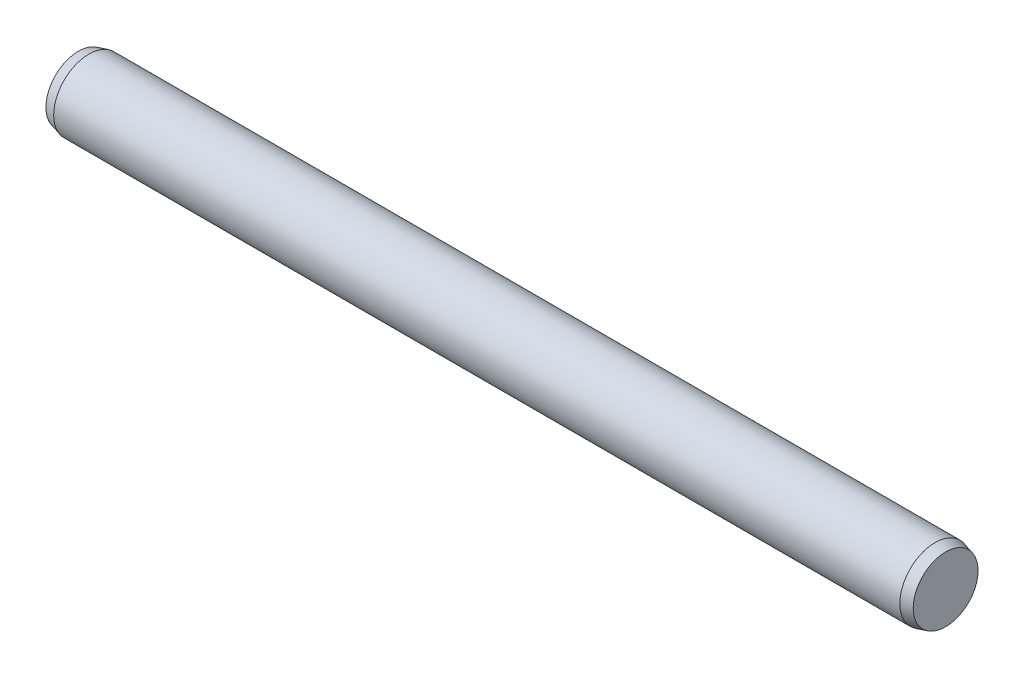
ISO-10303-21;
HEADER;
FILE_DESCRIPTION(('STEP AP214'),'2;1');
FILE_NAME('part.step','',(''),(''),'','','');
FILE_SCHEMA(('AUTOMOTIVE_DESIGN { 1 0 10303 214 1 1 1 1 }'));
ENDSEC;
DATA;
#1=APPLICATION_CONTEXT('core data for automotive mechanical design processes');
#2=APPLICATION_PROTOCOL_DEFINITION('international standard','automotive_design',2000,#1);
#3=PRODUCT_CONTEXT('',#1,'mechanical');
#4=PRODUCT('Part','Part','',(#3));
#5=PRODUCT_RELATED_PRODUCT_CATEGORY('part','',(#4));
#6=PRODUCT_DEFINITION_FORMATION('','',#4);
#7=PRODUCT_DEFINITION_CONTEXT('part definition',#1,'design');
#8=PRODUCT_DEFINITION('design','',#6,#7);
#9=PRODUCT_DEFINITION_SHAPE('','',#8);
#10=(LENGTH_UNIT() NAMED_UNIT(*) SI_UNIT(.MILLI.,.METRE.));
#11=(NAMED_UNIT(*) PLANE_ANGLE_UNIT() SI_UNIT($,.RADIAN.));
#12=(NAMED_UNIT(*) SI_UNIT($,.STERADIAN.) SOLID_ANGLE_UNIT());
#13=UNCERTAINTY_MEASURE_WITH_UNIT(LENGTH_MEASURE(1.E-05),#10,'distance_accuracy_value','');
#14=(GEOMETRIC_REPRESENTATION_CONTEXT(3) GLOBAL_UNCERTAINTY_ASSIGNED_CONTEXT((#13)) GLOBAL_UNIT_ASSIGNED_CONTEXT((#10,
#11,#12)) REPRESENTATION_CONTEXT('',''));
#15=CARTESIAN_POINT('',(0.,0.,0.));
#16=DIRECTION('',(0.,0.,1.));
#17=DIRECTION('',(1.,0.,0.));
#18=AXIS2_PLACEMENT_3D('',#15,#16,#17);
#19=CARTESIAN_POINT('',(-12.,0.,0.));
#20=DIRECTION('',(1.,0.,0.));
#21=DIRECTION('',(0.,0.,1.));
#22=AXIS2_PLACEMENT_3D('',#19,#20,#21);
#23=CYLINDRICAL_SURFACE('',#22,1.);
#24=CARTESIAN_POINT('',(-12.,0.,0.));
#25=DIRECTION('',(1.,0.,0.));
#26=DIRECTION('',(0.,0.,-1.));
#27=AXIS2_PLACEMENT_3D('',#24,#25,#26);
#28=CIRCLE('',#27,1.);
#29=CARTESIAN_POINT('',(-12.,0.,-1.));
#30=VERTEX_POINT('',#29);
#31=EDGE_CURVE('E49',#30,#30,#28,.T.);
#32=ORIENTED_EDGE('',*,*,#31,.T.);
#33=EDGE_LOOP('',(#32));
#34=FACE_BOUND('',#33,.T.);
#35=CARTESIAN_POINT('',(12.,0.,0.));
#36=DIRECTION('',(-1.,0.,0.));
#37=DIRECTION('',(0.,0.,1.));
#38=AXIS2_PLACEMENT_3D('',#35,#36,#37);
#39=CIRCLE('',#38,1.);
#40=CARTESIAN_POINT('',(12.,0.,1.));
#41=VERTEX_POINT('',#40);
#42=EDGE_CURVE('E10',#41,#41,#39,.T.);
#43=ORIENTED_EDGE('',*,*,#42,.T.);
#44=EDGE_LOOP('',(#43));
#45=FACE_BOUND('',#44,.T.);
#46=ADVANCED_FACE('F35',(#34,#45),#23,.T.);
#47=CARTESIAN_POINT('',(12.,0.,0.));
#48=DIRECTION('',(-1.,0.,0.));
#49=DIRECTION('',(0.,0.,1.));
#50=AXIS2_PLACEMENT_3D('',#47,#48,#49);
#51=CONICAL_SURFACE('',#50,1.,0.26179938779915);
#52=CARTESIAN_POINT('',(12.3,0.,0.));
#53=DIRECTION('',(-1.,0.,0.));
#54=DIRECTION('',(0.,0.,1.));
#55=AXIS2_PLACEMENT_3D('',#52,#53,#54);
#56=CIRCLE('',#55,0.919615242270664);
#57=CARTESIAN_POINT('',(12.3,0.,0.919615242270664));
#58=VERTEX_POINT('',#57);
#59=EDGE_CURVE('E41',#58,#58,#56,.T.);
#60=ORIENTED_EDGE('',*,*,#59,.T.);
#61=EDGE_LOOP('',(#60));
#62=FACE_BOUND('',#61,.T.);
#63=ORIENTED_EDGE('',*,*,#42,.F.);
#64=EDGE_LOOP('',(#63));
#65=FACE_BOUND('',#64,.T.);
#66=ADVANCED_FACE('F68',(#62,#65),#51,.T.);
#67=CARTESIAN_POINT('',(12.3,0.,0.));
#68=DIRECTION('',(1.,0.,0.));
#69=DIRECTION('',(0.,0.,1.));
#70=AXIS2_PLACEMENT_3D('',#67,#68,#69);
#71=PLANE('',#70);
#72=ORIENTED_EDGE('',*,*,#59,.F.);
#73=EDGE_LOOP('',(#72));
#74=FACE_BOUND('',#73,.T.);
#75=ADVANCED_FACE('F59',(#74),#71,.T.);
#76=CARTESIAN_POINT('',(-12.,0.,0.));
#77=DIRECTION('',(1.,0.,0.));
#78=DIRECTION('',(0.,0.,-1.));
#79=AXIS2_PLACEMENT_3D('',#76,#77,#78);
#80=CONICAL_SURFACE('',#79,1.,0.26179938779915);
#81=CARTESIAN_POINT('',(-12.3,0.,0.));
#82=DIRECTION('',(1.,0.,0.));
#83=DIRECTION('',(0.,0.,-1.));
#84=AXIS2_PLACEMENT_3D('',#81,#82,#83);
#85=CIRCLE('',#84,0.919615242270665);
#86=CARTESIAN_POINT('',(-12.3,0.,-0.919615242270665));
#87=VERTEX_POINT('',#86);
#88=EDGE_CURVE('E45',#87,#87,#85,.T.);
#89=ORIENTED_EDGE('',*,*,#88,.T.);
#90=EDGE_LOOP('',(#89));
#91=FACE_BOUND('',#90,.T.);
#92=ORIENTED_EDGE('',*,*,#31,.F.);
#93=EDGE_LOOP('',(#92));
#94=FACE_BOUND('',#93,.T.);
#95=ADVANCED_FACE('F56',(#91,#94),#80,.T.);
#96=CARTESIAN_POINT('',(-12.3,0.,0.));
#97=DIRECTION('',(-1.,0.,0.));
#98=DIRECTION('',(0.,0.,-1.));
#99=AXIS2_PLACEMENT_3D('',#96,#97,#98);
#100=PLANE('',#99);
#101=ORIENTED_EDGE('',*,*,#88,.F.);
#102=EDGE_LOOP('',(#101));
#103=FACE_BOUND('',#102,.T.);
#104=ADVANCED_FACE('F58',(#103),#100,.T.);
#105=CLOSED_SHELL('',(#46,#66,#75,#95,#104));
#106=MANIFOLD_SOLID_BREP('B2',#105);
#107=ADVANCED_BREP_SHAPE_REPRESENTATION('',(#18,#106),#14);
#108=SHAPE_DEFINITION_REPRESENTATION(#9,#107);
ENDSEC;
END-ISO-10303-21;
